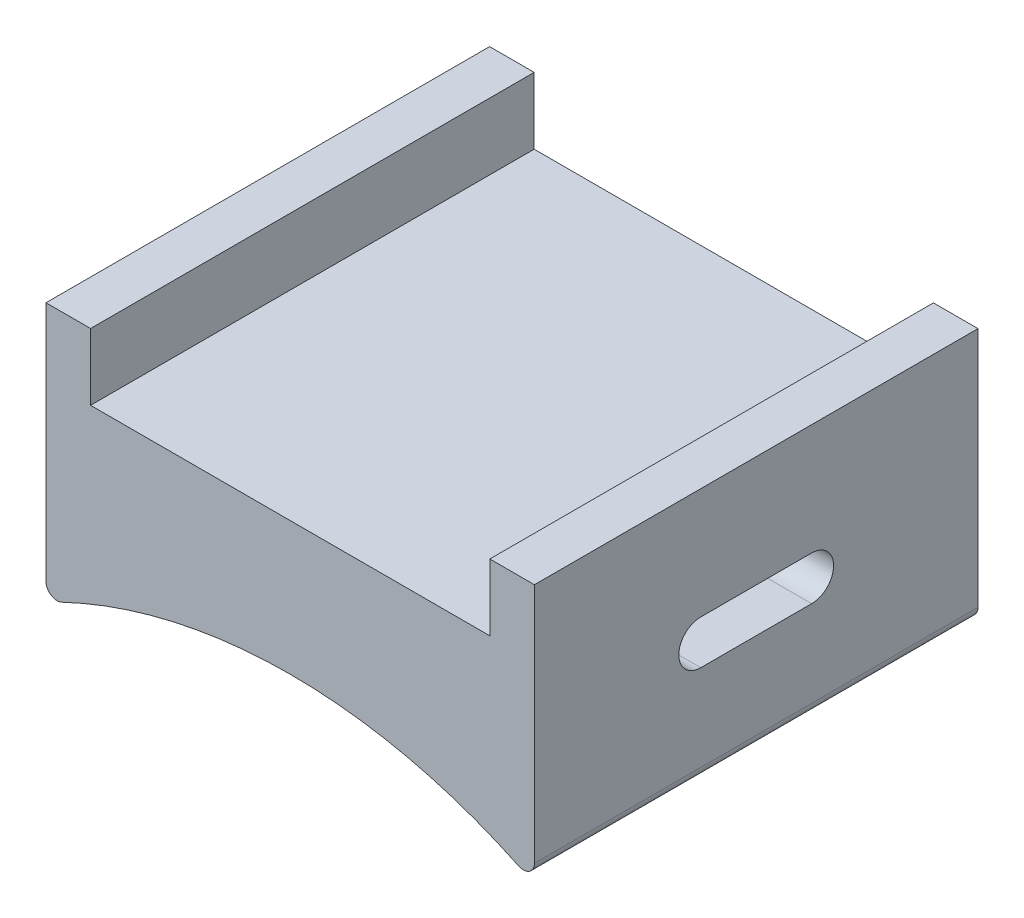
ISO-10303-21;
HEADER;
FILE_DESCRIPTION(('STEP AP214'),'2;1');
FILE_NAME('part.step','',(''),(''),'','','');
FILE_SCHEMA(('AUTOMOTIVE_DESIGN { 1 0 10303 214 1 1 1 1 }'));
ENDSEC;
DATA;
#1=APPLICATION_CONTEXT('core data for automotive mechanical design processes');
#2=APPLICATION_PROTOCOL_DEFINITION('international standard','automotive_design',2000,#1);
#3=PRODUCT_CONTEXT('',#1,'mechanical');
#4=PRODUCT('Part','Part','',(#3));
#5=PRODUCT_RELATED_PRODUCT_CATEGORY('part','',(#4));
#6=PRODUCT_DEFINITION_FORMATION('','',#4);
#7=PRODUCT_DEFINITION_CONTEXT('part definition',#1,'design');
#8=PRODUCT_DEFINITION('design','',#6,#7);
#9=PRODUCT_DEFINITION_SHAPE('','',#8);
#10=(LENGTH_UNIT() NAMED_UNIT(*) SI_UNIT(.MILLI.,.METRE.));
#11=(NAMED_UNIT(*) PLANE_ANGLE_UNIT() SI_UNIT($,.RADIAN.));
#12=(NAMED_UNIT(*) SI_UNIT($,.STERADIAN.) SOLID_ANGLE_UNIT());
#13=UNCERTAINTY_MEASURE_WITH_UNIT(LENGTH_MEASURE(1.E-05),#10,'distance_accuracy_value','');
#14=(GEOMETRIC_REPRESENTATION_CONTEXT(3) GLOBAL_UNCERTAINTY_ASSIGNED_CONTEXT((#13)) GLOBAL_UNIT_ASSIGNED_CONTEXT((#10,
#11,#12)) REPRESENTATION_CONTEXT('',''));
#15=CARTESIAN_POINT('',(0.,0.,0.));
#16=DIRECTION('',(0.,0.,1.));
#17=DIRECTION('',(1.,0.,0.));
#18=AXIS2_PLACEMENT_3D('',#15,#16,#17);
#19=CARTESIAN_POINT('',(10.51,-4.88388796897867,20.));
#20=DIRECTION('',(0.,0.,-1.));
#21=DIRECTION('',(-1.,0.,0.));
#22=AXIS2_PLACEMENT_3D('',#19,#20,#21);
#23=CYLINDRICAL_SURFACE('',#22,0.500000000000003);
#24=CARTESIAN_POINT('',(10.51,-4.88388796897867,0.));
#25=DIRECTION('',(0.,0.,1.));
#26=DIRECTION('',(1.,0.,0.));
#27=AXIS2_PLACEMENT_3D('',#24,#25,#26);
#28=CIRCLE('',#27,0.500000000000003);
#29=CARTESIAN_POINT('',(10.2942775041051,-5.3349575919471,0.));
#30=VERTEX_POINT('',#29);
#31=CARTESIAN_POINT('',(11.01,-4.88388796897867,0.));
#32=VERTEX_POINT('',#31);
#33=EDGE_CURVE('E178',#30,#32,#28,.T.);
#34=ORIENTED_EDGE('',*,*,#33,.T.);
#35=DIRECTION('',(0.,0.,-1.));
#36=VECTOR('',#35,1.);
#37=CARTESIAN_POINT('',(11.01,-4.88388796897867,20.));
#38=LINE('',#37,#36);
#39=CARTESIAN_POINT('',(11.01,-4.88388796897867,20.));
#40=VERTEX_POINT('',#39);
#41=EDGE_CURVE('E11',#40,#32,#38,.T.);
#42=ORIENTED_EDGE('',*,*,#41,.F.);
#43=CARTESIAN_POINT('',(10.51,-4.88388796897867,20.));
#44=DIRECTION('',(0.,0.,1.));
#45=DIRECTION('',(1.,0.,0.));
#46=AXIS2_PLACEMENT_3D('',#43,#44,#45);
#47=CIRCLE('',#46,0.500000000000003);
#48=CARTESIAN_POINT('',(10.2942775041051,-5.3349575919471,20.));
#49=VERTEX_POINT('',#48);
#50=EDGE_CURVE('E180',#49,#40,#47,.T.);
#51=ORIENTED_EDGE('',*,*,#50,.F.);
#52=DIRECTION('',(0.,0.,-1.));
#53=VECTOR('',#52,1.);
#54=CARTESIAN_POINT('',(10.2942775041051,-5.3349575919471,20.));
#55=LINE('',#54,#53);
#56=EDGE_CURVE('E212',#49,#30,#55,.T.);
#57=ORIENTED_EDGE('',*,*,#56,.T.);
#58=EDGE_LOOP('',(#34,#42,#51,#57));
#59=FACE_BOUND('',#58,.T.);
#60=ADVANCED_FACE('F39',(#59),#23,.T.);
#61=CARTESIAN_POINT('',(11.01,6.00000000000001,20.));
#62=DIRECTION('',(-1.,0.,0.));
#63=DIRECTION('',(0.,0.,1.));
#64=AXIS2_PLACEMENT_3D('',#61,#62,#63);
#65=PLANE('',#64);
#66=DIRECTION('',(0.,0.,-1.));
#67=VECTOR('',#66,1.);
#68=CARTESIAN_POINT('',(11.01,-0.989999999999993,12.5));
#69=LINE('',#68,#67);
#70=CARTESIAN_POINT('',(11.01,-0.989999999999993,12.5));
#71=VERTEX_POINT('',#70);
#72=CARTESIAN_POINT('',(11.01,-0.989999999999993,7.5));
#73=VERTEX_POINT('',#72);
#74=EDGE_CURVE('E153',#71,#73,#69,.T.);
#75=ORIENTED_EDGE('',*,*,#74,.F.);
#76=CARTESIAN_POINT('',(11.01,0.,12.5));
#77=DIRECTION('',(1.,0.,0.));
#78=DIRECTION('',(0.,0.,-1.));
#79=AXIS2_PLACEMENT_3D('',#76,#77,#78);
#80=CIRCLE('',#79,0.99);
#81=CARTESIAN_POINT('',(11.01,0.990000000000007,12.5));
#82=VERTEX_POINT('',#81);
#83=EDGE_CURVE('E54',#82,#71,#80,.T.);
#84=ORIENTED_EDGE('',*,*,#83,.F.);
#85=DIRECTION('',(0.,0.,1.));
#86=VECTOR('',#85,1.);
#87=CARTESIAN_POINT('',(11.01,0.990000000000007,12.5));
#88=LINE('',#87,#86);
#89=CARTESIAN_POINT('',(11.01,0.990000000000007,7.5));
#90=VERTEX_POINT('',#89);
#91=EDGE_CURVE('E161',#90,#82,#88,.T.);
#92=ORIENTED_EDGE('',*,*,#91,.F.);
#93=CARTESIAN_POINT('',(11.01,0.,7.5));
#94=DIRECTION('',(1.,0.,0.));
#95=DIRECTION('',(0.,0.,-1.));
#96=AXIS2_PLACEMENT_3D('',#93,#94,#95);
#97=CIRCLE('',#96,0.99);
#98=EDGE_CURVE('E143',#73,#90,#97,.T.);
#99=ORIENTED_EDGE('',*,*,#98,.F.);
#100=EDGE_LOOP('',(#75,#84,#92,#99));
#101=FACE_BOUND('',#100,.T.);
#102=DIRECTION('',(0.,1.,0.));
#103=VECTOR('',#102,1.);
#104=CARTESIAN_POINT('',(11.01,6.00000000000001,0.));
#105=LINE('',#104,#103);
#106=CARTESIAN_POINT('',(11.01,6.00000000000001,0.));
#107=VERTEX_POINT('',#106);
#108=EDGE_CURVE('E216',#32,#107,#105,.T.);
#109=ORIENTED_EDGE('',*,*,#108,.T.);
#110=DIRECTION('',(0.,0.,-1.));
#111=VECTOR('',#110,1.);
#112=CARTESIAN_POINT('',(11.01,6.00000000000001,20.));
#113=LINE('',#112,#111);
#114=CARTESIAN_POINT('',(11.01,6.00000000000001,20.));
#115=VERTEX_POINT('',#114);
#116=EDGE_CURVE('E47',#115,#107,#113,.T.);
#117=ORIENTED_EDGE('',*,*,#116,.F.);
#118=DIRECTION('',(0.,1.,0.));
#119=VECTOR('',#118,1.);
#120=CARTESIAN_POINT('',(11.01,6.00000000000001,20.));
#121=LINE('',#120,#119);
#122=EDGE_CURVE('E184',#40,#115,#121,.T.);
#123=ORIENTED_EDGE('',*,*,#122,.F.);
#124=ORIENTED_EDGE('',*,*,#41,.T.);
#125=EDGE_LOOP('',(#109,#117,#123,#124));
#126=FACE_BOUND('',#125,.T.);
#127=ADVANCED_FACE('F158',(#101,#126),#65,.F.);
#128=CARTESIAN_POINT('',(11.01,6.00000000000001,20.));
#129=DIRECTION('',(0.,-1.,0.));
#130=DIRECTION('',(0.,0.,-1.));
#131=AXIS2_PLACEMENT_3D('',#128,#129,#130);
#132=PLANE('',#131);
#133=DIRECTION('',(-1.,0.,0.));
#134=VECTOR('',#133,1.);
#135=CARTESIAN_POINT('',(11.01,6.00000000000001,0.));
#136=LINE('',#135,#134);
#137=CARTESIAN_POINT('',(9.,6.00000000000001,0.));
#138=VERTEX_POINT('',#137);
#139=EDGE_CURVE('E219',#107,#138,#136,.T.);
#140=ORIENTED_EDGE('',*,*,#139,.T.);
#141=DIRECTION('',(0.,0.,-1.));
#142=VECTOR('',#141,1.);
#143=CARTESIAN_POINT('',(9.,6.00000000000001,20.));
#144=LINE('',#143,#142);
#145=CARTESIAN_POINT('',(9.,6.00000000000001,20.));
#146=VERTEX_POINT('',#145);
#147=EDGE_CURVE('E269',#146,#138,#144,.T.);
#148=ORIENTED_EDGE('',*,*,#147,.F.);
#149=DIRECTION('',(-1.,0.,0.));
#150=VECTOR('',#149,1.);
#151=CARTESIAN_POINT('',(11.01,6.00000000000001,20.));
#152=LINE('',#151,#150);
#153=EDGE_CURVE('E188',#115,#146,#152,.T.);
#154=ORIENTED_EDGE('',*,*,#153,.F.);
#155=ORIENTED_EDGE('',*,*,#116,.T.);
#156=EDGE_LOOP('',(#140,#148,#154,#155));
#157=FACE_BOUND('',#156,.T.);
#158=ADVANCED_FACE('F278',(#157),#132,.F.);
#159=CARTESIAN_POINT('',(9.,3.00000000000001,20.));
#160=DIRECTION('',(1.,0.,0.));
#161=DIRECTION('',(0.,0.,-1.));
#162=AXIS2_PLACEMENT_3D('',#159,#160,#161);
#163=PLANE('',#162);
#164=DIRECTION('',(0.,-1.,0.));
#165=VECTOR('',#164,1.);
#166=CARTESIAN_POINT('',(9.,3.00000000000001,0.));
#167=LINE('',#166,#165);
#168=CARTESIAN_POINT('',(9.,3.00000000000001,0.));
#169=VERTEX_POINT('',#168);
#170=EDGE_CURVE('E222',#138,#169,#167,.T.);
#171=ORIENTED_EDGE('',*,*,#170,.T.);
#172=DIRECTION('',(0.,0.,-1.));
#173=VECTOR('',#172,1.);
#174=CARTESIAN_POINT('',(9.,3.00000000000001,20.));
#175=LINE('',#174,#173);
#176=CARTESIAN_POINT('',(9.,3.00000000000001,20.));
#177=VERTEX_POINT('',#176);
#178=EDGE_CURVE('E265',#177,#169,#175,.T.);
#179=ORIENTED_EDGE('',*,*,#178,.F.);
#180=DIRECTION('',(0.,-1.,0.));
#181=VECTOR('',#180,1.);
#182=CARTESIAN_POINT('',(9.,3.00000000000001,20.));
#183=LINE('',#182,#181);
#184=EDGE_CURVE('E191',#146,#177,#183,.T.);
#185=ORIENTED_EDGE('',*,*,#184,.F.);
#186=ORIENTED_EDGE('',*,*,#147,.T.);
#187=EDGE_LOOP('',(#171,#179,#185,#186));
#188=FACE_BOUND('',#187,.T.);
#189=ADVANCED_FACE('F288',(#188),#163,.F.);
#190=CARTESIAN_POINT('',(-9.,3.,20.));
#191=DIRECTION('',(0.,-1.,0.));
#192=DIRECTION('',(1.,0.,0.));
#193=AXIS2_PLACEMENT_3D('',#190,#191,#192);
#194=PLANE('',#193);
#195=DIRECTION('',(-1.,0.,0.));
#196=VECTOR('',#195,1.);
#197=CARTESIAN_POINT('',(-9.,3.,0.));
#198=LINE('',#197,#196);
#199=CARTESIAN_POINT('',(-9.,3.,0.));
#200=VERTEX_POINT('',#199);
#201=EDGE_CURVE('E225',#169,#200,#198,.T.);
#202=ORIENTED_EDGE('',*,*,#201,.T.);
#203=DIRECTION('',(0.,0.,-1.));
#204=VECTOR('',#203,1.);
#205=CARTESIAN_POINT('',(-9.,3.,20.));
#206=LINE('',#205,#204);
#207=CARTESIAN_POINT('',(-9.,3.,20.));
#208=VERTEX_POINT('',#207);
#209=EDGE_CURVE('E261',#208,#200,#206,.T.);
#210=ORIENTED_EDGE('',*,*,#209,.F.);
#211=DIRECTION('',(-1.,0.,0.));
#212=VECTOR('',#211,1.);
#213=CARTESIAN_POINT('',(-9.,3.,20.));
#214=LINE('',#213,#212);
#215=EDGE_CURVE('E194',#177,#208,#214,.T.);
#216=ORIENTED_EDGE('',*,*,#215,.F.);
#217=ORIENTED_EDGE('',*,*,#178,.T.);
#218=EDGE_LOOP('',(#202,#210,#216,#217));
#219=FACE_BOUND('',#218,.T.);
#220=ADVANCED_FACE('F292',(#219),#194,.F.);
#221=CARTESIAN_POINT('',(-9.,3.,20.));
#222=DIRECTION('',(-1.,0.,0.));
#223=DIRECTION('',(0.,0.,1.));
#224=AXIS2_PLACEMENT_3D('',#221,#222,#223);
#225=PLANE('',#224);
#226=DIRECTION('',(0.,1.,0.));
#227=VECTOR('',#226,1.);
#228=CARTESIAN_POINT('',(-9.,3.,0.));
#229=LINE('',#228,#227);
#230=CARTESIAN_POINT('',(-9.,6.00000000000001,0.));
#231=VERTEX_POINT('',#230);
#232=EDGE_CURVE('E228',#200,#231,#229,.T.);
#233=ORIENTED_EDGE('',*,*,#232,.T.);
#234=DIRECTION('',(0.,0.,-1.));
#235=VECTOR('',#234,1.);
#236=CARTESIAN_POINT('',(-9.,6.00000000000001,20.));
#237=LINE('',#236,#235);
#238=CARTESIAN_POINT('',(-9.,6.00000000000001,20.));
#239=VERTEX_POINT('',#238);
#240=EDGE_CURVE('E257',#239,#231,#237,.T.);
#241=ORIENTED_EDGE('',*,*,#240,.F.);
#242=DIRECTION('',(0.,1.,0.));
#243=VECTOR('',#242,1.);
#244=CARTESIAN_POINT('',(-9.,3.,20.));
#245=LINE('',#244,#243);
#246=EDGE_CURVE('E197',#208,#239,#245,.T.);
#247=ORIENTED_EDGE('',*,*,#246,.F.);
#248=ORIENTED_EDGE('',*,*,#209,.T.);
#249=EDGE_LOOP('',(#233,#241,#247,#248));
#250=FACE_BOUND('',#249,.T.);
#251=ADVANCED_FACE('F322',(#250),#225,.F.);
#252=CARTESIAN_POINT('',(-9.,6.00000000000001,20.));
#253=DIRECTION('',(0.,-1.,0.));
#254=DIRECTION('',(0.,0.,-1.));
#255=AXIS2_PLACEMENT_3D('',#252,#253,#254);
#256=PLANE('',#255);
#257=DIRECTION('',(-1.,0.,0.));
#258=VECTOR('',#257,1.);
#259=CARTESIAN_POINT('',(-9.,6.00000000000001,0.));
#260=LINE('',#259,#258);
#261=CARTESIAN_POINT('',(-11.01,6.00000000000001,0.));
#262=VERTEX_POINT('',#261);
#263=EDGE_CURVE('E231',#231,#262,#260,.T.);
#264=ORIENTED_EDGE('',*,*,#263,.T.);
#265=DIRECTION('',(0.,0.,-1.));
#266=VECTOR('',#265,1.);
#267=CARTESIAN_POINT('',(-11.01,6.00000000000001,20.));
#268=LINE('',#267,#266);
#269=CARTESIAN_POINT('',(-11.01,6.00000000000001,20.));
#270=VERTEX_POINT('',#269);
#271=EDGE_CURVE('E253',#270,#262,#268,.T.);
#272=ORIENTED_EDGE('',*,*,#271,.F.);
#273=DIRECTION('',(-1.,0.,0.));
#274=VECTOR('',#273,1.);
#275=CARTESIAN_POINT('',(-9.,6.00000000000001,20.));
#276=LINE('',#275,#274);
#277=EDGE_CURVE('E200',#239,#270,#276,.T.);
#278=ORIENTED_EDGE('',*,*,#277,.F.);
#279=ORIENTED_EDGE('',*,*,#240,.T.);
#280=EDGE_LOOP('',(#264,#272,#278,#279));
#281=FACE_BOUND('',#280,.T.);
#282=ADVANCED_FACE('F319',(#281),#256,.F.);
#283=CARTESIAN_POINT('',(-11.01,6.00000000000001,20.));
#284=DIRECTION('',(1.,0.,0.));
#285=DIRECTION('',(0.,0.,-1.));
#286=AXIS2_PLACEMENT_3D('',#283,#284,#285);
#287=PLANE('',#286);
#288=DIRECTION('',(0.,0.,-1.));
#289=VECTOR('',#288,1.);
#290=CARTESIAN_POINT('',(-11.01,0.990000000000007,12.5));
#291=LINE('',#290,#289);
#292=CARTESIAN_POINT('',(-11.01,0.990000000000007,12.5));
#293=VERTEX_POINT('',#292);
#294=CARTESIAN_POINT('',(-11.01,0.990000000000007,7.5));
#295=VERTEX_POINT('',#294);
#296=EDGE_CURVE('E447',#293,#295,#291,.T.);
#297=ORIENTED_EDGE('',*,*,#296,.F.);
#298=CARTESIAN_POINT('',(-11.01,0.,12.5));
#299=DIRECTION('',(1.,0.,0.));
#300=DIRECTION('',(0.,0.,-1.));
#301=AXIS2_PLACEMENT_3D('',#298,#299,#300);
#302=CIRCLE('',#301,0.99);
#303=CARTESIAN_POINT('',(-11.01,-0.989999999999993,12.5));
#304=VERTEX_POINT('',#303);
#305=EDGE_CURVE('E179',#304,#293,#302,.F.);
#306=ORIENTED_EDGE('',*,*,#305,.F.);
#307=DIRECTION('',(0.,0.,1.));
#308=VECTOR('',#307,1.);
#309=CARTESIAN_POINT('',(-11.01,-0.989999999999993,12.5));
#310=LINE('',#309,#308);
#311=CARTESIAN_POINT('',(-11.01,-0.989999999999993,7.5));
#312=VERTEX_POINT('',#311);
#313=EDGE_CURVE('E175',#312,#304,#310,.T.);
#314=ORIENTED_EDGE('',*,*,#313,.F.);
#315=CARTESIAN_POINT('',(-11.01,0.,7.5));
#316=DIRECTION('',(1.,0.,0.));
#317=DIRECTION('',(0.,0.,-1.));
#318=AXIS2_PLACEMENT_3D('',#315,#316,#317);
#319=CIRCLE('',#318,0.99);
#320=EDGE_CURVE('E146',#295,#312,#319,.F.);
#321=ORIENTED_EDGE('',*,*,#320,.F.);
#322=EDGE_LOOP('',(#297,#306,#314,#321));
#323=FACE_BOUND('',#322,.T.);
#324=DIRECTION('',(0.,-1.,0.));
#325=VECTOR('',#324,1.);
#326=CARTESIAN_POINT('',(-11.01,6.00000000000001,0.));
#327=LINE('',#326,#325);
#328=CARTESIAN_POINT('',(-11.01,-4.88388796897867,0.));
#329=VERTEX_POINT('',#328);
#330=EDGE_CURVE('E234',#262,#329,#327,.T.);
#331=ORIENTED_EDGE('',*,*,#330,.T.);
#332=DIRECTION('',(0.,0.,-1.));
#333=VECTOR('',#332,1.);
#334=CARTESIAN_POINT('',(-11.01,-4.88388796897867,20.));
#335=LINE('',#334,#333);
#336=CARTESIAN_POINT('',(-11.01,-4.88388796897867,20.));
#337=VERTEX_POINT('',#336);
#338=EDGE_CURVE('E249',#337,#329,#335,.T.);
#339=ORIENTED_EDGE('',*,*,#338,.F.);
#340=DIRECTION('',(0.,-1.,0.));
#341=VECTOR('',#340,1.);
#342=CARTESIAN_POINT('',(-11.01,6.00000000000001,20.));
#343=LINE('',#342,#341);
#344=EDGE_CURVE('E203',#270,#337,#343,.T.);
#345=ORIENTED_EDGE('',*,*,#344,.F.);
#346=ORIENTED_EDGE('',*,*,#271,.T.);
#347=EDGE_LOOP('',(#331,#339,#345,#346));
#348=FACE_BOUND('',#347,.T.);
#349=ADVANCED_FACE('F315',(#323,#348),#287,.F.);
#350=CARTESIAN_POINT('',(-10.51,-4.88388796897867,20.));
#351=DIRECTION('',(0.,0.,-1.));
#352=DIRECTION('',(-1.,0.,0.));
#353=AXIS2_PLACEMENT_3D('',#350,#351,#352);
#354=CYLINDRICAL_SURFACE('',#353,0.500000000000004);
#355=CARTESIAN_POINT('',(-10.51,-4.88388796897867,0.));
#356=DIRECTION('',(0.,0.,1.));
#357=DIRECTION('',(-1.,0.,0.));
#358=AXIS2_PLACEMENT_3D('',#355,#356,#357);
#359=CIRCLE('',#358,0.500000000000004);
#360=CARTESIAN_POINT('',(-10.2942775041051,-5.3349575919471,0.));
#361=VERTEX_POINT('',#360);
#362=EDGE_CURVE('E237',#329,#361,#359,.T.);
#363=ORIENTED_EDGE('',*,*,#362,.T.);
#364=DIRECTION('',(0.,0.,-1.));
#365=VECTOR('',#364,1.);
#366=CARTESIAN_POINT('',(-10.2942775041051,-5.3349575919471,20.));
#367=LINE('',#366,#365);
#368=CARTESIAN_POINT('',(-10.2942775041051,-5.3349575919471,20.));
#369=VERTEX_POINT('',#368);
#370=EDGE_CURVE('E245',#369,#361,#367,.T.);
#371=ORIENTED_EDGE('',*,*,#370,.F.);
#372=CARTESIAN_POINT('',(-10.51,-4.88388796897867,20.));
#373=DIRECTION('',(0.,0.,1.));
#374=DIRECTION('',(-1.,0.,0.));
#375=AXIS2_PLACEMENT_3D('',#372,#373,#374);
#376=CIRCLE('',#375,0.500000000000004);
#377=EDGE_CURVE('E206',#337,#369,#376,.T.);
#378=ORIENTED_EDGE('',*,*,#377,.F.);
#379=ORIENTED_EDGE('',*,*,#338,.T.);
#380=EDGE_LOOP('',(#363,#371,#378,#379));
#381=FACE_BOUND('',#380,.T.);
#382=ADVANCED_FACE('F311',(#381),#354,.T.);
#383=CARTESIAN_POINT('',(0.,-26.86,20.));
#384=DIRECTION('',(0.,0.,-1.));
#385=DIRECTION('',(-1.,0.,0.));
#386=AXIS2_PLACEMENT_3D('',#383,#384,#385);
#387=CYLINDRICAL_SURFACE('',#386,23.86);
#388=CARTESIAN_POINT('',(0.,-26.86,0.));
#389=DIRECTION('',(0.,0.,-1.));
#390=DIRECTION('',(1.,0.,0.));
#391=AXIS2_PLACEMENT_3D('',#388,#389,#390);
#392=CIRCLE('',#391,23.86);
#393=EDGE_CURVE('E185',#361,#30,#392,.T.);
#394=ORIENTED_EDGE('',*,*,#393,.T.);
#395=ORIENTED_EDGE('',*,*,#56,.F.);
#396=CARTESIAN_POINT('',(0.,-26.86,20.));
#397=DIRECTION('',(0.,0.,-1.));
#398=DIRECTION('',(1.,0.,0.));
#399=AXIS2_PLACEMENT_3D('',#396,#397,#398);
#400=CIRCLE('',#399,23.86);
#401=EDGE_CURVE('E209',#369,#49,#400,.T.);
#402=ORIENTED_EDGE('',*,*,#401,.F.);
#403=ORIENTED_EDGE('',*,*,#370,.T.);
#404=EDGE_LOOP('',(#394,#395,#402,#403));
#405=FACE_BOUND('',#404,.T.);
#406=ADVANCED_FACE('F306',(#405),#387,.F.);
#407=CARTESIAN_POINT('',(10.51,-4.88388796897867,20.));
#408=DIRECTION('',(0.,0.,1.));
#409=DIRECTION('',(1.,0.,0.));
#410=AXIS2_PLACEMENT_3D('',#407,#408,#409);
#411=PLANE('',#410);
#412=ORIENTED_EDGE('',*,*,#50,.T.);
#413=ORIENTED_EDGE('',*,*,#122,.T.);
#414=ORIENTED_EDGE('',*,*,#153,.T.);
#415=ORIENTED_EDGE('',*,*,#184,.T.);
#416=ORIENTED_EDGE('',*,*,#215,.T.);
#417=ORIENTED_EDGE('',*,*,#246,.T.);
#418=ORIENTED_EDGE('',*,*,#277,.T.);
#419=ORIENTED_EDGE('',*,*,#344,.T.);
#420=ORIENTED_EDGE('',*,*,#377,.T.);
#421=ORIENTED_EDGE('',*,*,#401,.T.);
#422=EDGE_LOOP('',(#412,#413,#414,#415,#416,#417,#418,#419,#420,#421));
#423=FACE_BOUND('',#422,.T.);
#424=ADVANCED_FACE('F296',(#423),#411,.T.);
#425=CARTESIAN_POINT('',(10.51,-4.88388796897867,0.));
#426=DIRECTION('',(0.,0.,1.));
#427=DIRECTION('',(1.,0.,0.));
#428=AXIS2_PLACEMENT_3D('',#425,#426,#427);
#429=PLANE('',#428);
#430=ORIENTED_EDGE('',*,*,#33,.F.);
#431=ORIENTED_EDGE('',*,*,#393,.F.);
#432=ORIENTED_EDGE('',*,*,#362,.F.);
#433=ORIENTED_EDGE('',*,*,#330,.F.);
#434=ORIENTED_EDGE('',*,*,#263,.F.);
#435=ORIENTED_EDGE('',*,*,#232,.F.);
#436=ORIENTED_EDGE('',*,*,#201,.F.);
#437=ORIENTED_EDGE('',*,*,#170,.F.);
#438=ORIENTED_EDGE('',*,*,#139,.F.);
#439=ORIENTED_EDGE('',*,*,#108,.F.);
#440=EDGE_LOOP('',(#430,#431,#432,#433,#434,#435,#436,#437,#438,#439));
#441=FACE_BOUND('',#440,.T.);
#442=ADVANCED_FACE('F283',(#441),#429,.F.);
#443=CARTESIAN_POINT('',(-18.265397990462,0.,12.5));
#444=DIRECTION('',(1.,0.,0.));
#445=DIRECTION('',(0.,0.,-1.));
#446=AXIS2_PLACEMENT_3D('',#443,#444,#445);
#447=CYLINDRICAL_SURFACE('',#446,0.99);
#448=ORIENTED_EDGE('',*,*,#305,.T.);
#449=DIRECTION('',(1.,0.,0.));
#450=VECTOR('',#449,1.);
#451=CARTESIAN_POINT('',(-18.265397990462,0.990000000000007,12.5));
#452=LINE('',#451,#450);
#453=EDGE_CURVE('E168',#293,#82,#452,.T.);
#454=ORIENTED_EDGE('',*,*,#453,.T.);
#455=ORIENTED_EDGE('',*,*,#83,.T.);
#456=DIRECTION('',(1.,0.,0.));
#457=VECTOR('',#456,1.);
#458=CARTESIAN_POINT('',(-18.265397990462,-0.989999999999993,12.5));
#459=LINE('',#458,#457);
#460=EDGE_CURVE('E150',#304,#71,#459,.T.);
#461=ORIENTED_EDGE('',*,*,#460,.F.);
#462=EDGE_LOOP('',(#448,#454,#455,#461));
#463=FACE_BOUND('',#462,.T.);
#464=ADVANCED_FACE('F393',(#463),#447,.F.);
#465=CARTESIAN_POINT('',(-18.265397990462,0.990000000000007,12.5));
#466=DIRECTION('',(0.,1.,0.));
#467=DIRECTION('',(0.,0.,1.));
#468=AXIS2_PLACEMENT_3D('',#465,#466,#467);
#469=PLANE('',#468);
#470=ORIENTED_EDGE('',*,*,#296,.T.);
#471=DIRECTION('',(1.,0.,0.));
#472=VECTOR('',#471,1.);
#473=CARTESIAN_POINT('',(-18.265397990462,0.990000000000007,7.5));
#474=LINE('',#473,#472);
#475=EDGE_CURVE('E149',#295,#90,#474,.T.);
#476=ORIENTED_EDGE('',*,*,#475,.T.);
#477=ORIENTED_EDGE('',*,*,#91,.T.);
#478=ORIENTED_EDGE('',*,*,#453,.F.);
#479=EDGE_LOOP('',(#470,#476,#477,#478));
#480=FACE_BOUND('',#479,.T.);
#481=ADVANCED_FACE('F416',(#480),#469,.F.);
#482=CARTESIAN_POINT('',(-18.265397990462,0.,7.5));
#483=DIRECTION('',(1.,0.,0.));
#484=DIRECTION('',(0.,0.,-1.));
#485=AXIS2_PLACEMENT_3D('',#482,#483,#484);
#486=CYLINDRICAL_SURFACE('',#485,0.99);
#487=ORIENTED_EDGE('',*,*,#320,.T.);
#488=DIRECTION('',(1.,0.,0.));
#489=VECTOR('',#488,1.);
#490=CARTESIAN_POINT('',(-18.265397990462,-0.989999999999993,7.5));
#491=LINE('',#490,#489);
#492=EDGE_CURVE('E62',#312,#73,#491,.T.);
#493=ORIENTED_EDGE('',*,*,#492,.T.);
#494=ORIENTED_EDGE('',*,*,#98,.T.);
#495=ORIENTED_EDGE('',*,*,#475,.F.);
#496=EDGE_LOOP('',(#487,#493,#494,#495));
#497=FACE_BOUND('',#496,.T.);
#498=ADVANCED_FACE('F140',(#497),#486,.F.);
#499=CARTESIAN_POINT('',(-18.265397990462,-0.989999999999993,12.5));
#500=DIRECTION('',(0.,-1.,0.));
#501=DIRECTION('',(0.,0.,-1.));
#502=AXIS2_PLACEMENT_3D('',#499,#500,#501);
#503=PLANE('',#502);
#504=ORIENTED_EDGE('',*,*,#313,.T.);
#505=ORIENTED_EDGE('',*,*,#460,.T.);
#506=ORIENTED_EDGE('',*,*,#74,.T.);
#507=ORIENTED_EDGE('',*,*,#492,.F.);
#508=EDGE_LOOP('',(#504,#505,#506,#507));
#509=FACE_BOUND('',#508,.T.);
#510=ADVANCED_FACE('F154',(#509),#503,.F.);
#511=CLOSED_SHELL('',(#60,#127,#158,#189,#220,#251,#282,#349,#382,#406,#424,#442,#464,#481,#498,#510));
#512=MANIFOLD_SOLID_BREP('B2',#511);
#513=ADVANCED_BREP_SHAPE_REPRESENTATION('',(#18,#512),#14);
#514=SHAPE_DEFINITION_REPRESENTATION(#9,#513);
ENDSEC;
END-ISO-10303-21;
